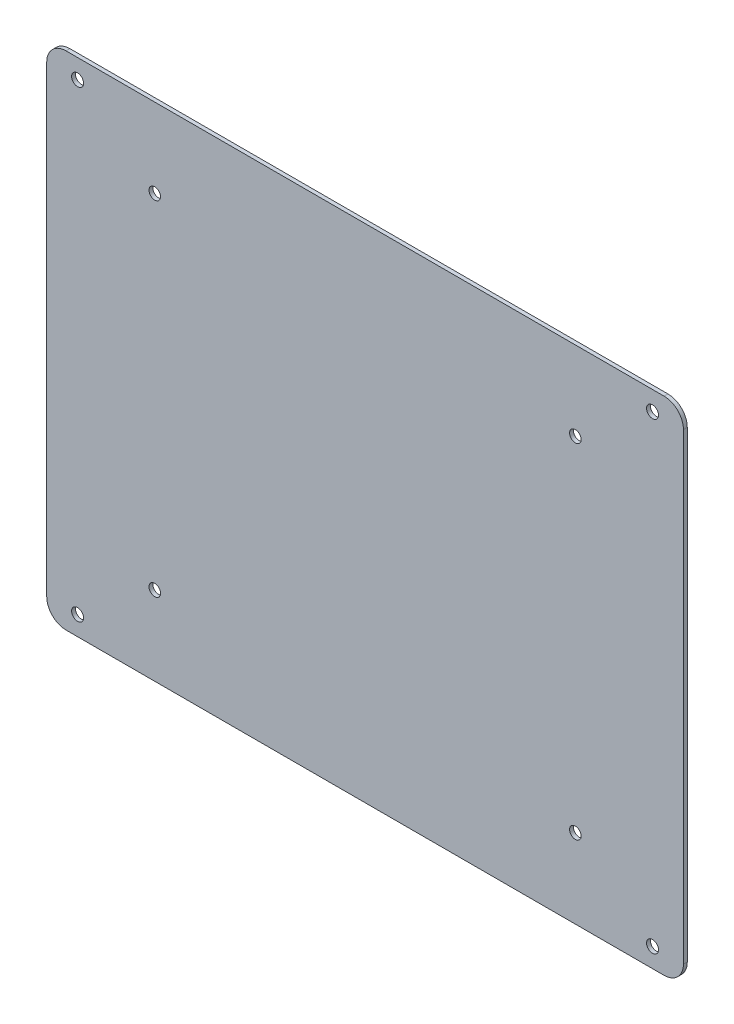
ISO-10303-21;
HEADER;
FILE_DESCRIPTION(('STEP AP214'),'2;1');
FILE_NAME('part.step','',(''),(''),'','','');
FILE_SCHEMA(('AUTOMOTIVE_DESIGN { 1 0 10303 214 1 1 1 1 }'));
ENDSEC;
DATA;
#1=APPLICATION_CONTEXT('core data for automotive mechanical design processes');
#2=APPLICATION_PROTOCOL_DEFINITION('international standard','automotive_design',2000,#1);
#3=PRODUCT_CONTEXT('',#1,'mechanical');
#4=PRODUCT('Part','Part','',(#3));
#5=PRODUCT_RELATED_PRODUCT_CATEGORY('part','',(#4));
#6=PRODUCT_DEFINITION_FORMATION('','',#4);
#7=PRODUCT_DEFINITION_CONTEXT('part definition',#1,'design');
#8=PRODUCT_DEFINITION('design','',#6,#7);
#9=PRODUCT_DEFINITION_SHAPE('','',#8);
#10=(LENGTH_UNIT() NAMED_UNIT(*) SI_UNIT(.MILLI.,.METRE.));
#11=(NAMED_UNIT(*) PLANE_ANGLE_UNIT() SI_UNIT($,.RADIAN.));
#12=(NAMED_UNIT(*) SI_UNIT($,.STERADIAN.) SOLID_ANGLE_UNIT());
#13=UNCERTAINTY_MEASURE_WITH_UNIT(LENGTH_MEASURE(1.E-05),#10,'distance_accuracy_value','');
#14=(GEOMETRIC_REPRESENTATION_CONTEXT(3) GLOBAL_UNCERTAINTY_ASSIGNED_CONTEXT((#13)) GLOBAL_UNIT_ASSIGNED_CONTEXT((#10,
#11,#12)) REPRESENTATION_CONTEXT('',''));
#15=CARTESIAN_POINT('',(0.,0.,0.));
#16=DIRECTION('',(0.,0.,1.));
#17=DIRECTION('',(1.,0.,0.));
#18=AXIS2_PLACEMENT_3D('',#15,#16,#17);
#19=CARTESIAN_POINT('',(77.5,60.,1.));
#20=DIRECTION('',(0.,0.,-1.));
#21=DIRECTION('',(-1.,0.,0.));
#22=AXIS2_PLACEMENT_3D('',#19,#20,#21);
#23=PLANE('',#22);
#24=CARTESIAN_POINT('',(54.5,44.5,1.));
#25=DIRECTION('',(0.,0.,1.));
#26=DIRECTION('',(1.,0.,0.));
#27=AXIS2_PLACEMENT_3D('',#24,#25,#26);
#28=CIRCLE('',#27,1.5);
#29=CARTESIAN_POINT('',(56.,44.5,1.));
#30=VERTEX_POINT('',#29);
#31=EDGE_CURVE('E285',#30,#30,#28,.T.);
#32=ORIENTED_EDGE('',*,*,#31,.F.);
#33=EDGE_LOOP('',(#32));
#34=FACE_BOUND('',#33,.T.);
#35=CARTESIAN_POINT('',(54.5,-44.5,1.));
#36=DIRECTION('',(0.,0.,1.));
#37=DIRECTION('',(1.,0.,0.));
#38=AXIS2_PLACEMENT_3D('',#35,#36,#37);
#39=CIRCLE('',#38,1.5);
#40=CARTESIAN_POINT('',(56.,-44.5,1.));
#41=VERTEX_POINT('',#40);
#42=EDGE_CURVE('E281',#41,#41,#39,.T.);
#43=ORIENTED_EDGE('',*,*,#42,.F.);
#44=EDGE_LOOP('',(#43));
#45=FACE_BOUND('',#44,.T.);
#46=CARTESIAN_POINT('',(-54.5,-44.5,1.));
#47=DIRECTION('',(0.,0.,1.));
#48=DIRECTION('',(1.,0.,0.));
#49=AXIS2_PLACEMENT_3D('',#46,#47,#48);
#50=CIRCLE('',#49,1.5);
#51=CARTESIAN_POINT('',(-53.,-44.5,1.));
#52=VERTEX_POINT('',#51);
#53=EDGE_CURVE('E279',#52,#52,#50,.T.);
#54=ORIENTED_EDGE('',*,*,#53,.F.);
#55=EDGE_LOOP('',(#54));
#56=FACE_BOUND('',#55,.T.);
#57=CARTESIAN_POINT('',(-54.5,44.5,1.));
#58=DIRECTION('',(0.,0.,1.));
#59=DIRECTION('',(1.,0.,0.));
#60=AXIS2_PLACEMENT_3D('',#57,#58,#59);
#61=CIRCLE('',#60,1.5);
#62=CARTESIAN_POINT('',(-53.,44.5,1.));
#63=VERTEX_POINT('',#62);
#64=EDGE_CURVE('E167',#63,#63,#61,.T.);
#65=ORIENTED_EDGE('',*,*,#64,.F.);
#66=EDGE_LOOP('',(#65));
#67=FACE_BOUND('',#66,.T.);
#68=CARTESIAN_POINT('',(77.5,60.,1.));
#69=DIRECTION('',(0.,0.,1.));
#70=DIRECTION('',(-1.,0.,0.));
#71=AXIS2_PLACEMENT_3D('',#68,#69,#70);
#72=CIRCLE('',#71,5.);
#73=CARTESIAN_POINT('',(82.5,60.,1.));
#74=VERTEX_POINT('',#73);
#75=CARTESIAN_POINT('',(77.5,65.,1.));
#76=VERTEX_POINT('',#75);
#77=EDGE_CURVE('E151',#74,#76,#72,.T.);
#78=ORIENTED_EDGE('',*,*,#77,.T.);
#79=DIRECTION('',(-1.,0.,0.));
#80=VECTOR('',#79,1.);
#81=CARTESIAN_POINT('',(-77.5,65.,1.));
#82=LINE('',#81,#80);
#83=CARTESIAN_POINT('',(-77.5,65.,1.));
#84=VERTEX_POINT('',#83);
#85=EDGE_CURVE('E99',#76,#84,#82,.T.);
#86=ORIENTED_EDGE('',*,*,#85,.T.);
#87=CARTESIAN_POINT('',(-77.5,60.,1.));
#88=DIRECTION('',(0.,0.,1.));
#89=DIRECTION('',(1.,0.,0.));
#90=AXIS2_PLACEMENT_3D('',#87,#88,#89);
#91=CIRCLE('',#90,5.);
#92=CARTESIAN_POINT('',(-82.5,60.,1.));
#93=VERTEX_POINT('',#92);
#94=EDGE_CURVE('E205',#84,#93,#91,.T.);
#95=ORIENTED_EDGE('',*,*,#94,.T.);
#96=DIRECTION('',(0.,-1.,0.));
#97=VECTOR('',#96,1.);
#98=CARTESIAN_POINT('',(-82.5,60.,1.));
#99=LINE('',#98,#97);
#100=CARTESIAN_POINT('',(-82.5,-59.9999999999999,1.));
#101=VERTEX_POINT('',#100);
#102=EDGE_CURVE('E207',#93,#101,#99,.T.);
#103=ORIENTED_EDGE('',*,*,#102,.T.);
#104=CARTESIAN_POINT('',(-77.5,-60.,1.));
#105=DIRECTION('',(0.,0.,1.));
#106=DIRECTION('',(1.,0.,0.));
#107=AXIS2_PLACEMENT_3D('',#104,#105,#106);
#108=CIRCLE('',#107,5.);
#109=CARTESIAN_POINT('',(-77.5,-65.,1.));
#110=VERTEX_POINT('',#109);
#111=EDGE_CURVE('E118',#101,#110,#108,.T.);
#112=ORIENTED_EDGE('',*,*,#111,.T.);
#113=DIRECTION('',(1.,0.,0.));
#114=VECTOR('',#113,1.);
#115=CARTESIAN_POINT('',(-77.5,-65.,1.));
#116=LINE('',#115,#114);
#117=CARTESIAN_POINT('',(77.5,-65.,1.));
#118=VERTEX_POINT('',#117);
#119=EDGE_CURVE('E112',#110,#118,#116,.T.);
#120=ORIENTED_EDGE('',*,*,#119,.T.);
#121=CARTESIAN_POINT('',(77.5,-60.,1.));
#122=DIRECTION('',(0.,0.,1.));
#123=DIRECTION('',(1.,0.,0.));
#124=AXIS2_PLACEMENT_3D('',#121,#122,#123);
#125=CIRCLE('',#124,5.);
#126=CARTESIAN_POINT('',(82.5,-60.,1.));
#127=VERTEX_POINT('',#126);
#128=EDGE_CURVE('E116',#118,#127,#125,.T.);
#129=ORIENTED_EDGE('',*,*,#128,.T.);
#130=DIRECTION('',(0.,1.,0.));
#131=VECTOR('',#130,1.);
#132=CARTESIAN_POINT('',(82.5,60.,1.));
#133=LINE('',#132,#131);
#134=EDGE_CURVE('E56',#127,#74,#133,.T.);
#135=ORIENTED_EDGE('',*,*,#134,.T.);
#136=EDGE_LOOP('',(#78,#86,#95,#103,#112,#120,#129,#135));
#137=FACE_BOUND('',#136,.T.);
#138=CARTESIAN_POINT('',(-74.5,60.,1.));
#139=DIRECTION('',(0.,0.,1.));
#140=DIRECTION('',(1.,0.,0.));
#141=AXIS2_PLACEMENT_3D('',#138,#139,#140);
#142=CIRCLE('',#141,1.54999999999999);
#143=CARTESIAN_POINT('',(-72.95,60.,1.));
#144=VERTEX_POINT('',#143);
#145=EDGE_CURVE('E140',#144,#144,#142,.T.);
#146=ORIENTED_EDGE('',*,*,#145,.F.);
#147=EDGE_LOOP('',(#146));
#148=FACE_BOUND('',#147,.T.);
#149=CARTESIAN_POINT('',(74.5,60.,1.));
#150=DIRECTION('',(0.,0.,1.));
#151=DIRECTION('',(1.,0.,0.));
#152=AXIS2_PLACEMENT_3D('',#149,#150,#151);
#153=CIRCLE('',#152,1.54999999999999);
#154=CARTESIAN_POINT('',(76.05,60.,1.));
#155=VERTEX_POINT('',#154);
#156=EDGE_CURVE('E193',#155,#155,#153,.T.);
#157=ORIENTED_EDGE('',*,*,#156,.F.);
#158=EDGE_LOOP('',(#157));
#159=FACE_BOUND('',#158,.T.);
#160=CARTESIAN_POINT('',(74.5,-60.,1.));
#161=DIRECTION('',(0.,0.,1.));
#162=DIRECTION('',(1.,0.,0.));
#163=AXIS2_PLACEMENT_3D('',#160,#161,#162);
#164=CIRCLE('',#163,1.54999999999999);
#165=CARTESIAN_POINT('',(76.05,-60.,1.));
#166=VERTEX_POINT('',#165);
#167=EDGE_CURVE('E187',#166,#166,#164,.T.);
#168=ORIENTED_EDGE('',*,*,#167,.F.);
#169=EDGE_LOOP('',(#168));
#170=FACE_BOUND('',#169,.T.);
#171=CARTESIAN_POINT('',(-74.5,-60.,1.));
#172=DIRECTION('',(0.,0.,1.));
#173=DIRECTION('',(1.,0.,0.));
#174=AXIS2_PLACEMENT_3D('',#171,#172,#173);
#175=CIRCLE('',#174,1.54999999999999);
#176=CARTESIAN_POINT('',(-72.95,-60.,1.));
#177=VERTEX_POINT('',#176);
#178=EDGE_CURVE('E178',#177,#177,#175,.T.);
#179=ORIENTED_EDGE('',*,*,#178,.F.);
#180=EDGE_LOOP('',(#179));
#181=FACE_BOUND('',#180,.T.);
#182=ADVANCED_FACE('F37',(#34,#45,#56,#67,#137,#148,#159,#170,#181),#23,.F.);
#183=CARTESIAN_POINT('',(77.5,60.,0.));
#184=DIRECTION('',(0.,0.,-1.));
#185=DIRECTION('',(-1.,0.,0.));
#186=AXIS2_PLACEMENT_3D('',#183,#184,#185);
#187=PLANE('',#186);
#188=CARTESIAN_POINT('',(54.5,44.5,0.));
#189=DIRECTION('',(0.,0.,-1.));
#190=DIRECTION('',(-1.,0.,0.));
#191=AXIS2_PLACEMENT_3D('',#188,#189,#190);
#192=CIRCLE('',#191,1.5);
#193=CARTESIAN_POINT('',(53.,44.5,0.));
#194=VERTEX_POINT('',#193);
#195=EDGE_CURVE('E41',#194,#194,#192,.T.);
#196=ORIENTED_EDGE('',*,*,#195,.F.);
#197=EDGE_LOOP('',(#196));
#198=FACE_BOUND('',#197,.T.);
#199=CARTESIAN_POINT('',(54.5,-44.5,0.));
#200=DIRECTION('',(0.,0.,-1.));
#201=DIRECTION('',(-1.,0.,0.));
#202=AXIS2_PLACEMENT_3D('',#199,#200,#201);
#203=CIRCLE('',#202,1.5);
#204=CARTESIAN_POINT('',(53.,-44.5,0.));
#205=VERTEX_POINT('',#204);
#206=EDGE_CURVE('E169',#205,#205,#203,.T.);
#207=ORIENTED_EDGE('',*,*,#206,.F.);
#208=EDGE_LOOP('',(#207));
#209=FACE_BOUND('',#208,.T.);
#210=CARTESIAN_POINT('',(-54.5,-44.5,0.));
#211=DIRECTION('',(0.,0.,-1.));
#212=DIRECTION('',(-1.,0.,0.));
#213=AXIS2_PLACEMENT_3D('',#210,#211,#212);
#214=CIRCLE('',#213,1.5);
#215=CARTESIAN_POINT('',(-56.,-44.5,0.));
#216=VERTEX_POINT('',#215);
#217=EDGE_CURVE('E166',#216,#216,#214,.T.);
#218=ORIENTED_EDGE('',*,*,#217,.F.);
#219=EDGE_LOOP('',(#218));
#220=FACE_BOUND('',#219,.T.);
#221=CARTESIAN_POINT('',(-54.5,44.5,0.));
#222=DIRECTION('',(0.,0.,-1.));
#223=DIRECTION('',(-1.,0.,0.));
#224=AXIS2_PLACEMENT_3D('',#221,#222,#223);
#225=CIRCLE('',#224,1.5);
#226=CARTESIAN_POINT('',(-56.,44.5,0.));
#227=VERTEX_POINT('',#226);
#228=EDGE_CURVE('E163',#227,#227,#225,.T.);
#229=ORIENTED_EDGE('',*,*,#228,.F.);
#230=EDGE_LOOP('',(#229));
#231=FACE_BOUND('',#230,.T.);
#232=CARTESIAN_POINT('',(74.5,-60.,0.));
#233=DIRECTION('',(0.,0.,1.));
#234=DIRECTION('',(1.,0.,0.));
#235=AXIS2_PLACEMENT_3D('',#232,#233,#234);
#236=CIRCLE('',#235,1.54999999999999);
#237=CARTESIAN_POINT('',(76.05,-60.,0.));
#238=VERTEX_POINT('',#237);
#239=EDGE_CURVE('E183',#238,#238,#236,.T.);
#240=ORIENTED_EDGE('',*,*,#239,.T.);
#241=EDGE_LOOP('',(#240));
#242=FACE_BOUND('',#241,.T.);
#243=CARTESIAN_POINT('',(-74.5,60.,0.));
#244=DIRECTION('',(0.,0.,1.));
#245=DIRECTION('',(1.,0.,0.));
#246=AXIS2_PLACEMENT_3D('',#243,#244,#245);
#247=CIRCLE('',#246,1.54999999999999);
#248=CARTESIAN_POINT('',(-72.95,60.,0.));
#249=VERTEX_POINT('',#248);
#250=EDGE_CURVE('E196',#249,#249,#247,.T.);
#251=ORIENTED_EDGE('',*,*,#250,.T.);
#252=EDGE_LOOP('',(#251));
#253=FACE_BOUND('',#252,.T.);
#254=CARTESIAN_POINT('',(77.5,60.,0.));
#255=DIRECTION('',(0.,0.,1.));
#256=DIRECTION('',(-1.,0.,0.));
#257=AXIS2_PLACEMENT_3D('',#254,#255,#256);
#258=CIRCLE('',#257,5.);
#259=CARTESIAN_POINT('',(82.5,60.,0.));
#260=VERTEX_POINT('',#259);
#261=CARTESIAN_POINT('',(77.5,65.,0.));
#262=VERTEX_POINT('',#261);
#263=EDGE_CURVE('E136',#260,#262,#258,.T.);
#264=ORIENTED_EDGE('',*,*,#263,.F.);
#265=DIRECTION('',(0.,1.,0.));
#266=VECTOR('',#265,1.);
#267=CARTESIAN_POINT('',(82.5,60.,0.));
#268=LINE('',#267,#266);
#269=CARTESIAN_POINT('',(82.5,-60.,0.));
#270=VERTEX_POINT('',#269);
#271=EDGE_CURVE('E91',#270,#260,#268,.T.);
#272=ORIENTED_EDGE('',*,*,#271,.F.);
#273=CARTESIAN_POINT('',(77.5,-60.,0.));
#274=DIRECTION('',(0.,0.,1.));
#275=DIRECTION('',(1.,0.,0.));
#276=AXIS2_PLACEMENT_3D('',#273,#274,#275);
#277=CIRCLE('',#276,5.);
#278=CARTESIAN_POINT('',(77.5,-65.,0.));
#279=VERTEX_POINT('',#278);
#280=EDGE_CURVE('E85',#279,#270,#277,.T.);
#281=ORIENTED_EDGE('',*,*,#280,.F.);
#282=DIRECTION('',(1.,0.,0.));
#283=VECTOR('',#282,1.);
#284=CARTESIAN_POINT('',(-77.5,-65.,0.));
#285=LINE('',#284,#283);
#286=CARTESIAN_POINT('',(-77.5,-65.,0.));
#287=VERTEX_POINT('',#286);
#288=EDGE_CURVE('E126',#287,#279,#285,.T.);
#289=ORIENTED_EDGE('',*,*,#288,.F.);
#290=CARTESIAN_POINT('',(-77.5,-60.,0.));
#291=DIRECTION('',(0.,0.,1.));
#292=DIRECTION('',(1.,0.,0.));
#293=AXIS2_PLACEMENT_3D('',#290,#291,#292);
#294=CIRCLE('',#293,5.);
#295=CARTESIAN_POINT('',(-82.5,-59.9999999999999,0.));
#296=VERTEX_POINT('',#295);
#297=EDGE_CURVE('E146',#296,#287,#294,.T.);
#298=ORIENTED_EDGE('',*,*,#297,.F.);
#299=DIRECTION('',(0.,-1.,0.));
#300=VECTOR('',#299,1.);
#301=CARTESIAN_POINT('',(-82.5,60.,0.));
#302=LINE('',#301,#300);
#303=CARTESIAN_POINT('',(-82.5,60.,0.));
#304=VERTEX_POINT('',#303);
#305=EDGE_CURVE('E144',#304,#296,#302,.T.);
#306=ORIENTED_EDGE('',*,*,#305,.F.);
#307=CARTESIAN_POINT('',(-77.5,60.,0.));
#308=DIRECTION('',(0.,0.,1.));
#309=DIRECTION('',(1.,0.,0.));
#310=AXIS2_PLACEMENT_3D('',#307,#308,#309);
#311=CIRCLE('',#310,5.);
#312=CARTESIAN_POINT('',(-77.5,65.,0.));
#313=VERTEX_POINT('',#312);
#314=EDGE_CURVE('E142',#313,#304,#311,.T.);
#315=ORIENTED_EDGE('',*,*,#314,.F.);
#316=DIRECTION('',(-1.,0.,0.));
#317=VECTOR('',#316,1.);
#318=CARTESIAN_POINT('',(-77.5,65.,0.));
#319=LINE('',#318,#317);
#320=EDGE_CURVE('E139',#262,#313,#319,.T.);
#321=ORIENTED_EDGE('',*,*,#320,.F.);
#322=EDGE_LOOP('',(#264,#272,#281,#289,#298,#306,#315,#321));
#323=FACE_BOUND('',#322,.T.);
#324=CARTESIAN_POINT('',(74.5,60.,0.));
#325=DIRECTION('',(0.,0.,1.));
#326=DIRECTION('',(1.,0.,0.));
#327=AXIS2_PLACEMENT_3D('',#324,#325,#326);
#328=CIRCLE('',#327,1.54999999999999);
#329=CARTESIAN_POINT('',(76.05,60.,0.));
#330=VERTEX_POINT('',#329);
#331=EDGE_CURVE('E190',#330,#330,#328,.T.);
#332=ORIENTED_EDGE('',*,*,#331,.T.);
#333=EDGE_LOOP('',(#332));
#334=FACE_BOUND('',#333,.T.);
#335=CARTESIAN_POINT('',(-74.5,-60.,0.));
#336=DIRECTION('',(0.,0.,1.));
#337=DIRECTION('',(1.,0.,0.));
#338=AXIS2_PLACEMENT_3D('',#335,#336,#337);
#339=CIRCLE('',#338,1.54999999999999);
#340=CARTESIAN_POINT('',(-72.95,-60.,0.));
#341=VERTEX_POINT('',#340);
#342=EDGE_CURVE('E174',#341,#341,#339,.T.);
#343=ORIENTED_EDGE('',*,*,#342,.T.);
#344=EDGE_LOOP('',(#343));
#345=FACE_BOUND('',#344,.T.);
#346=ADVANCED_FACE('F220',(#198,#209,#220,#231,#242,#253,#323,#334,#345),#187,.T.);
#347=CARTESIAN_POINT('',(77.5,60.,1.));
#348=DIRECTION('',(0.,0.,-1.));
#349=DIRECTION('',(-1.,0.,0.));
#350=AXIS2_PLACEMENT_3D('',#347,#348,#349);
#351=CYLINDRICAL_SURFACE('',#350,5.);
#352=ORIENTED_EDGE('',*,*,#263,.T.);
#353=DIRECTION('',(0.,0.,-1.));
#354=VECTOR('',#353,1.);
#355=CARTESIAN_POINT('',(77.5,65.,1.));
#356=LINE('',#355,#354);
#357=EDGE_CURVE('E11',#76,#262,#356,.T.);
#358=ORIENTED_EDGE('',*,*,#357,.F.);
#359=ORIENTED_EDGE('',*,*,#77,.F.);
#360=DIRECTION('',(0.,0.,-1.));
#361=VECTOR('',#360,1.);
#362=CARTESIAN_POINT('',(82.5,60.,1.));
#363=LINE('',#362,#361);
#364=EDGE_CURVE('E132',#74,#260,#363,.T.);
#365=ORIENTED_EDGE('',*,*,#364,.T.);
#366=EDGE_LOOP('',(#352,#358,#359,#365));
#367=FACE_BOUND('',#366,.T.);
#368=ADVANCED_FACE('F39',(#367),#351,.T.);
#369=CARTESIAN_POINT('',(-77.5,65.,1.));
#370=DIRECTION('',(0.,-1.,0.));
#371=DIRECTION('',(0.,0.,-1.));
#372=AXIS2_PLACEMENT_3D('',#369,#370,#371);
#373=PLANE('',#372);
#374=ORIENTED_EDGE('',*,*,#320,.T.);
#375=DIRECTION('',(0.,0.,-1.));
#376=VECTOR('',#375,1.);
#377=CARTESIAN_POINT('',(-77.5,65.,1.));
#378=LINE('',#377,#376);
#379=EDGE_CURVE('E47',#84,#313,#378,.T.);
#380=ORIENTED_EDGE('',*,*,#379,.F.);
#381=ORIENTED_EDGE('',*,*,#85,.F.);
#382=ORIENTED_EDGE('',*,*,#357,.T.);
#383=EDGE_LOOP('',(#374,#380,#381,#382));
#384=FACE_BOUND('',#383,.T.);
#385=ADVANCED_FACE('F384',(#384),#373,.F.);
#386=CARTESIAN_POINT('',(-77.5,60.,1.));
#387=DIRECTION('',(0.,0.,-1.));
#388=DIRECTION('',(-1.,0.,0.));
#389=AXIS2_PLACEMENT_3D('',#386,#387,#388);
#390=CYLINDRICAL_SURFACE('',#389,5.);
#391=ORIENTED_EDGE('',*,*,#314,.T.);
#392=DIRECTION('',(0.,0.,-1.));
#393=VECTOR('',#392,1.);
#394=CARTESIAN_POINT('',(-82.5,60.,1.));
#395=LINE('',#394,#393);
#396=EDGE_CURVE('E158',#93,#304,#395,.T.);
#397=ORIENTED_EDGE('',*,*,#396,.F.);
#398=ORIENTED_EDGE('',*,*,#94,.F.);
#399=ORIENTED_EDGE('',*,*,#379,.T.);
#400=EDGE_LOOP('',(#391,#397,#398,#399));
#401=FACE_BOUND('',#400,.T.);
#402=ADVANCED_FACE('F376',(#401),#390,.T.);
#403=CARTESIAN_POINT('',(-82.5,60.,1.));
#404=DIRECTION('',(1.,0.,0.));
#405=DIRECTION('',(0.,0.,-1.));
#406=AXIS2_PLACEMENT_3D('',#403,#404,#405);
#407=PLANE('',#406);
#408=ORIENTED_EDGE('',*,*,#305,.T.);
#409=DIRECTION('',(0.,0.,-1.));
#410=VECTOR('',#409,1.);
#411=CARTESIAN_POINT('',(-82.5,-59.9999999999999,1.));
#412=LINE('',#411,#410);
#413=EDGE_CURVE('E155',#101,#296,#412,.T.);
#414=ORIENTED_EDGE('',*,*,#413,.F.);
#415=ORIENTED_EDGE('',*,*,#102,.F.);
#416=ORIENTED_EDGE('',*,*,#396,.T.);
#417=EDGE_LOOP('',(#408,#414,#415,#416));
#418=FACE_BOUND('',#417,.T.);
#419=ADVANCED_FACE('F213',(#418),#407,.F.);
#420=CARTESIAN_POINT('',(-77.5,-60.,1.));
#421=DIRECTION('',(0.,0.,-1.));
#422=DIRECTION('',(-1.,0.,0.));
#423=AXIS2_PLACEMENT_3D('',#420,#421,#422);
#424=CYLINDRICAL_SURFACE('',#423,5.);
#425=ORIENTED_EDGE('',*,*,#297,.T.);
#426=DIRECTION('',(0.,0.,-1.));
#427=VECTOR('',#426,1.);
#428=CARTESIAN_POINT('',(-77.5,-65.,1.));
#429=LINE('',#428,#427);
#430=EDGE_CURVE('E127',#110,#287,#429,.T.);
#431=ORIENTED_EDGE('',*,*,#430,.F.);
#432=ORIENTED_EDGE('',*,*,#111,.F.);
#433=ORIENTED_EDGE('',*,*,#413,.T.);
#434=EDGE_LOOP('',(#425,#431,#432,#433));
#435=FACE_BOUND('',#434,.T.);
#436=ADVANCED_FACE('F217',(#435),#424,.T.);
#437=CARTESIAN_POINT('',(-77.5,-65.,1.));
#438=DIRECTION('',(0.,1.,0.));
#439=DIRECTION('',(0.,0.,1.));
#440=AXIS2_PLACEMENT_3D('',#437,#438,#439);
#441=PLANE('',#440);
#442=ORIENTED_EDGE('',*,*,#288,.T.);
#443=DIRECTION('',(0.,0.,-1.));
#444=VECTOR('',#443,1.);
#445=CARTESIAN_POINT('',(77.5,-65.,1.));
#446=LINE('',#445,#444);
#447=EDGE_CURVE('E123',#118,#279,#446,.T.);
#448=ORIENTED_EDGE('',*,*,#447,.F.);
#449=ORIENTED_EDGE('',*,*,#119,.F.);
#450=ORIENTED_EDGE('',*,*,#430,.T.);
#451=EDGE_LOOP('',(#442,#448,#449,#450));
#452=FACE_BOUND('',#451,.T.);
#453=ADVANCED_FACE('F124',(#452),#441,.F.);
#454=CARTESIAN_POINT('',(77.5,-60.,1.));
#455=DIRECTION('',(0.,0.,-1.));
#456=DIRECTION('',(-1.,0.,0.));
#457=AXIS2_PLACEMENT_3D('',#454,#455,#456);
#458=CYLINDRICAL_SURFACE('',#457,5.);
#459=ORIENTED_EDGE('',*,*,#280,.T.);
#460=DIRECTION('',(0.,0.,-1.));
#461=VECTOR('',#460,1.);
#462=CARTESIAN_POINT('',(82.5,-60.,1.));
#463=LINE('',#462,#461);
#464=EDGE_CURVE('E128',#127,#270,#463,.T.);
#465=ORIENTED_EDGE('',*,*,#464,.F.);
#466=ORIENTED_EDGE('',*,*,#128,.F.);
#467=ORIENTED_EDGE('',*,*,#447,.T.);
#468=EDGE_LOOP('',(#459,#465,#466,#467));
#469=FACE_BOUND('',#468,.T.);
#470=ADVANCED_FACE('F130',(#469),#458,.T.);
#471=CARTESIAN_POINT('',(82.5,60.,1.));
#472=DIRECTION('',(-1.,0.,0.));
#473=DIRECTION('',(0.,0.,1.));
#474=AXIS2_PLACEMENT_3D('',#471,#472,#473);
#475=PLANE('',#474);
#476=ORIENTED_EDGE('',*,*,#271,.T.);
#477=ORIENTED_EDGE('',*,*,#364,.F.);
#478=ORIENTED_EDGE('',*,*,#134,.F.);
#479=ORIENTED_EDGE('',*,*,#464,.T.);
#480=EDGE_LOOP('',(#476,#477,#478,#479));
#481=FACE_BOUND('',#480,.T.);
#482=ADVANCED_FACE('F226',(#481),#475,.F.);
#483=CARTESIAN_POINT('',(-74.5,60.,1.));
#484=DIRECTION('',(0.,0.,-1.));
#485=DIRECTION('',(-1.,0.,0.));
#486=AXIS2_PLACEMENT_3D('',#483,#484,#485);
#487=CYLINDRICAL_SURFACE('',#486,1.54999999999999);
#488=ORIENTED_EDGE('',*,*,#145,.T.);
#489=EDGE_LOOP('',(#488));
#490=FACE_BOUND('',#489,.T.);
#491=ORIENTED_EDGE('',*,*,#250,.F.);
#492=EDGE_LOOP('',(#491));
#493=FACE_BOUND('',#492,.T.);
#494=ADVANCED_FACE('F228',(#490,#493),#487,.F.);
#495=CARTESIAN_POINT('',(74.5,60.,1.));
#496=DIRECTION('',(0.,0.,-1.));
#497=DIRECTION('',(-1.,0.,0.));
#498=AXIS2_PLACEMENT_3D('',#495,#496,#497);
#499=CYLINDRICAL_SURFACE('',#498,1.54999999999999);
#500=ORIENTED_EDGE('',*,*,#156,.T.);
#501=EDGE_LOOP('',(#500));
#502=FACE_BOUND('',#501,.T.);
#503=ORIENTED_EDGE('',*,*,#331,.F.);
#504=EDGE_LOOP('',(#503));
#505=FACE_BOUND('',#504,.T.);
#506=ADVANCED_FACE('F234',(#502,#505),#499,.F.);
#507=CARTESIAN_POINT('',(74.5,-60.,1.));
#508=DIRECTION('',(0.,0.,-1.));
#509=DIRECTION('',(-1.,0.,0.));
#510=AXIS2_PLACEMENT_3D('',#507,#508,#509);
#511=CYLINDRICAL_SURFACE('',#510,1.54999999999999);
#512=ORIENTED_EDGE('',*,*,#167,.T.);
#513=EDGE_LOOP('',(#512));
#514=FACE_BOUND('',#513,.T.);
#515=ORIENTED_EDGE('',*,*,#239,.F.);
#516=EDGE_LOOP('',(#515));
#517=FACE_BOUND('',#516,.T.);
#518=ADVANCED_FACE('F251',(#514,#517),#511,.F.);
#519=CARTESIAN_POINT('',(-74.5,-60.,1.));
#520=DIRECTION('',(0.,0.,-1.));
#521=DIRECTION('',(-1.,0.,0.));
#522=AXIS2_PLACEMENT_3D('',#519,#520,#521);
#523=CYLINDRICAL_SURFACE('',#522,1.54999999999999);
#524=ORIENTED_EDGE('',*,*,#178,.T.);
#525=EDGE_LOOP('',(#524));
#526=FACE_BOUND('',#525,.T.);
#527=ORIENTED_EDGE('',*,*,#342,.F.);
#528=EDGE_LOOP('',(#527));
#529=FACE_BOUND('',#528,.T.);
#530=ADVANCED_FACE('F255',(#526,#529),#523,.F.);
#531=CARTESIAN_POINT('',(-54.5,44.5,-9.));
#532=DIRECTION('',(0.,0.,1.));
#533=DIRECTION('',(1.,0.,0.));
#534=AXIS2_PLACEMENT_3D('',#531,#532,#533);
#535=CYLINDRICAL_SURFACE('',#534,1.5);
#536=ORIENTED_EDGE('',*,*,#228,.T.);
#537=EDGE_LOOP('',(#536));
#538=FACE_BOUND('',#537,.T.);
#539=ORIENTED_EDGE('',*,*,#64,.T.);
#540=EDGE_LOOP('',(#539));
#541=FACE_BOUND('',#540,.T.);
#542=ADVANCED_FACE('F259',(#538,#541),#535,.F.);
#543=CARTESIAN_POINT('',(-54.5,-44.5,-9.));
#544=DIRECTION('',(0.,0.,1.));
#545=DIRECTION('',(1.,0.,0.));
#546=AXIS2_PLACEMENT_3D('',#543,#544,#545);
#547=CYLINDRICAL_SURFACE('',#546,1.5);
#548=ORIENTED_EDGE('',*,*,#217,.T.);
#549=EDGE_LOOP('',(#548));
#550=FACE_BOUND('',#549,.T.);
#551=ORIENTED_EDGE('',*,*,#53,.T.);
#552=EDGE_LOOP('',(#551));
#553=FACE_BOUND('',#552,.T.);
#554=ADVANCED_FACE('F263',(#550,#553),#547,.F.);
#555=CARTESIAN_POINT('',(54.5,-44.5,-9.));
#556=DIRECTION('',(0.,0.,1.));
#557=DIRECTION('',(1.,0.,0.));
#558=AXIS2_PLACEMENT_3D('',#555,#556,#557);
#559=CYLINDRICAL_SURFACE('',#558,1.5);
#560=ORIENTED_EDGE('',*,*,#206,.T.);
#561=EDGE_LOOP('',(#560));
#562=FACE_BOUND('',#561,.T.);
#563=ORIENTED_EDGE('',*,*,#42,.T.);
#564=EDGE_LOOP('',(#563));
#565=FACE_BOUND('',#564,.T.);
#566=ADVANCED_FACE('F268',(#562,#565),#559,.F.);
#567=CARTESIAN_POINT('',(54.5,44.5,-9.));
#568=DIRECTION('',(0.,0.,1.));
#569=DIRECTION('',(1.,0.,0.));
#570=AXIS2_PLACEMENT_3D('',#567,#568,#569);
#571=CYLINDRICAL_SURFACE('',#570,1.5);
#572=ORIENTED_EDGE('',*,*,#195,.T.);
#573=EDGE_LOOP('',(#572));
#574=FACE_BOUND('',#573,.T.);
#575=ORIENTED_EDGE('',*,*,#31,.T.);
#576=EDGE_LOOP('',(#575));
#577=FACE_BOUND('',#576,.T.);
#578=ADVANCED_FACE('F265',(#574,#577),#571,.F.);
#579=CLOSED_SHELL('',(#182,#346,#368,#385,#402,#419,#436,#453,#470,#482,#494,#506,#518,#530,
#542,#554,#566,#578));
#580=MANIFOLD_SOLID_BREP('B2',#579);
#581=ADVANCED_BREP_SHAPE_REPRESENTATION('',(#18,#580),#14);
#582=SHAPE_DEFINITION_REPRESENTATION(#9,#581);
ENDSEC;
END-ISO-10303-21;
